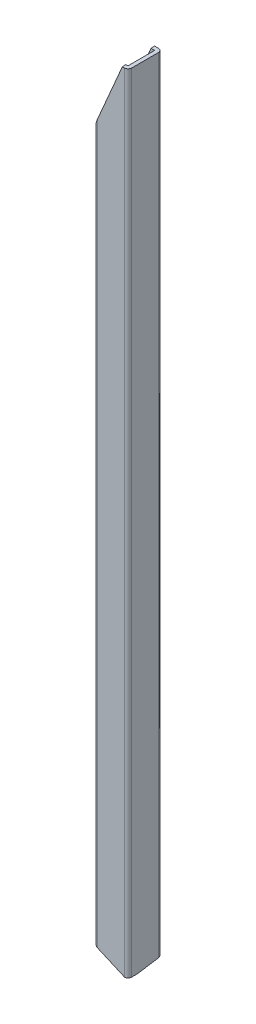
ISO-10303-21;
HEADER;
FILE_DESCRIPTION(('STEP AP214'),'2;1');
FILE_NAME('part.step','',(''),(''),'','','');
FILE_SCHEMA(('AUTOMOTIVE_DESIGN { 1 0 10303 214 1 1 1 1 }'));
ENDSEC;
DATA;
#1=APPLICATION_CONTEXT('core data for automotive mechanical design processes');
#2=APPLICATION_PROTOCOL_DEFINITION('international standard','automotive_design',2000,#1);
#3=PRODUCT_CONTEXT('',#1,'mechanical');
#4=PRODUCT('Part','Part','',(#3));
#5=PRODUCT_RELATED_PRODUCT_CATEGORY('part','',(#4));
#6=PRODUCT_DEFINITION_FORMATION('','',#4);
#7=PRODUCT_DEFINITION_CONTEXT('part definition',#1,'design');
#8=PRODUCT_DEFINITION('design','',#6,#7);
#9=PRODUCT_DEFINITION_SHAPE('','',#8);
#10=(LENGTH_UNIT() NAMED_UNIT(*) SI_UNIT(.MILLI.,.METRE.));
#11=(NAMED_UNIT(*) PLANE_ANGLE_UNIT() SI_UNIT($,.RADIAN.));
#12=(NAMED_UNIT(*) SI_UNIT($,.STERADIAN.) SOLID_ANGLE_UNIT());
#13=UNCERTAINTY_MEASURE_WITH_UNIT(LENGTH_MEASURE(1.E-05),#10,'distance_accuracy_value','');
#14=(GEOMETRIC_REPRESENTATION_CONTEXT(3) GLOBAL_UNCERTAINTY_ASSIGNED_CONTEXT((#13)) GLOBAL_UNIT_ASSIGNED_CONTEXT((#10,
#11,#12)) REPRESENTATION_CONTEXT('',''));
#15=CARTESIAN_POINT('',(0.,0.,0.));
#16=DIRECTION('',(0.,0.,1.));
#17=DIRECTION('',(1.,0.,0.));
#18=AXIS2_PLACEMENT_3D('',#15,#16,#17);
#19=CARTESIAN_POINT('',(2.80000000000002,590.8,0.));
#20=DIRECTION('',(0.,0.,1.));
#21=DIRECTION('',(1.,0.,0.));
#22=AXIS2_PLACEMENT_3D('',#19,#20,#21);
#23=PLANE('',#22);
#24=DIRECTION('',(0.39540036227563,0.918508875031864,0.));
#25=VECTOR('',#24,1.);
#26=CARTESIAN_POINT('',(17.2174877375602,584.593549491465,0.));
#27=LINE('',#26,#25);
#28=CARTESIAN_POINT('',(2.79999999999993,551.101950327524,0.));
#29=VERTEX_POINT('',#28);
#30=CARTESIAN_POINT('',(19.8892450239942,590.8,0.));
#31=VERTEX_POINT('',#30);
#32=EDGE_CURVE('E166',#29,#31,#27,.T.);
#33=ORIENTED_EDGE('',*,*,#32,.T.);
#34=DIRECTION('',(-1.,0.,0.));
#35=VECTOR('',#34,1.);
#36=CARTESIAN_POINT('',(2.80000000000002,590.8,0.));
#37=LINE('',#36,#35);
#38=CARTESIAN_POINT('',(22.8,590.8,0.));
#39=VERTEX_POINT('',#38);
#40=EDGE_CURVE('E191',#39,#31,#37,.T.);
#41=ORIENTED_EDGE('',*,*,#40,.F.);
#42=DIRECTION('',(0.,-1.,0.));
#43=VECTOR('',#42,1.);
#44=CARTESIAN_POINT('',(22.8,590.8,0.));
#45=LINE('',#44,#43);
#46=CARTESIAN_POINT('',(22.8,4.11609931174119,0.));
#47=VERTEX_POINT('',#46);
#48=EDGE_CURVE('E124',#39,#47,#45,.T.);
#49=ORIENTED_EDGE('',*,*,#48,.T.);
#50=DIRECTION('',(0.915754313649765,-0.401738767150804,0.));
#51=VECTOR('',#50,1.);
#52=CARTESIAN_POINT('',(-209.809611486821,106.161262684985,0.));
#53=LINE('',#52,#51);
#54=CARTESIAN_POINT('',(2.80000000000002,12.8900414305539,0.));
#55=VERTEX_POINT('',#54);
#56=EDGE_CURVE('E110',#55,#47,#53,.T.);
#57=ORIENTED_EDGE('',*,*,#56,.F.);
#58=DIRECTION('',(0.,-1.,0.));
#59=VECTOR('',#58,1.);
#60=CARTESIAN_POINT('',(2.80000000000002,590.8,0.));
#61=LINE('',#60,#59);
#62=EDGE_CURVE('E120',#29,#55,#61,.T.);
#63=ORIENTED_EDGE('',*,*,#62,.F.);
#64=EDGE_LOOP('',(#33,#41,#49,#57,#63));
#65=FACE_BOUND('',#64,.T.);
#66=ADVANCED_FACE('F38',(#65),#23,.F.);
#67=CARTESIAN_POINT('',(2.8,590.8,2.8));
#68=DIRECTION('',(0.,-1.,0.));
#69=DIRECTION('',(0.,0.,-1.));
#70=AXIS2_PLACEMENT_3D('',#67,#68,#69);
#71=CYLINDRICAL_SURFACE('',#70,2.8);
#72=CARTESIAN_POINT('',(2.8,550.732963372258,2.8));
#73=DIRECTION('',(-0.917264503130894,0.394864684163176,0.0520356848398305));
#74=DIRECTION('',(-0.394230836374375,-0.918739289026389,0.0223644014193281));
#75=AXIS2_PLACEMENT_3D('',#72,#73,#74);
#76=ELLIPSE('',#75,7.09103678373758,2.8);
#77=CARTESIAN_POINT('',(0.,544.22860704014,2.80000000000002));
#78=VERTEX_POINT('',#77);
#79=EDGE_CURVE('E240',#29,#78,#76,.T.);
#80=ORIENTED_EDGE('',*,*,#79,.F.);
#81=ORIENTED_EDGE('',*,*,#62,.T.);
#82=CARTESIAN_POINT('',(2.8,12.4565004084244,2.8));
#83=DIRECTION('',(-0.397760197031321,-0.906685254233582,-0.140387589953636));
#84=DIRECTION('',(0.854994325271738,-0.421807835104311,0.301766224083711));
#85=AXIS2_PLACEMENT_3D('',#82,#83,#84);
#86=ELLIPSE('',#85,3.08817198352567,2.8);
#87=CARTESIAN_POINT('',(0.,13.684852305058,2.80000000000002));
#88=VERTEX_POINT('',#87);
#89=EDGE_CURVE('E156',#88,#55,#86,.T.);
#90=ORIENTED_EDGE('',*,*,#89,.F.);
#91=DIRECTION('',(0.,-1.,0.));
#92=VECTOR('',#91,1.);
#93=CARTESIAN_POINT('',(0.,590.8,2.80000000000002));
#94=LINE('',#93,#92);
#95=EDGE_CURVE('E123',#78,#88,#94,.T.);
#96=ORIENTED_EDGE('',*,*,#95,.F.);
#97=EDGE_LOOP('',(#80,#81,#90,#96));
#98=FACE_BOUND('',#97,.T.);
#99=ADVANCED_FACE('F234',(#98),#71,.T.);
#100=CARTESIAN_POINT('',(0.,590.8,2.80000000000002));
#101=DIRECTION('',(1.,0.,0.));
#102=DIRECTION('',(0.,0.,-1.));
#103=AXIS2_PLACEMENT_3D('',#100,#101,#102);
#104=PLANE('',#103);
#105=DIRECTION('',(0.,-0.130651475613471,0.991428359449145));
#106=VECTOR('',#105,1.);
#107=CARTESIAN_POINT('',(0.,545.023571779982,-3.23246602566669));
#108=LINE('',#107,#106);
#109=CARTESIAN_POINT('',(0.,541.592985931096,22.8));
#110=VERTEX_POINT('',#109);
#111=EDGE_CURVE('E206',#78,#110,#108,.T.);
#112=ORIENTED_EDGE('',*,*,#111,.F.);
#113=ORIENTED_EDGE('',*,*,#95,.T.);
#114=DIRECTION('',(0.,0.153012762588992,-0.988224212658688));
#115=VECTOR('',#114,1.);
#116=CARTESIAN_POINT('',(0.,27.1967947293815,-84.4661106030328));
#117=LINE('',#116,#115);
#118=CARTESIAN_POINT('',(0.,10.5881307184189,22.8));
#119=VERTEX_POINT('',#118);
#120=EDGE_CURVE('E162',#119,#88,#117,.T.);
#121=ORIENTED_EDGE('',*,*,#120,.F.);
#122=DIRECTION('',(0.,-1.,0.));
#123=VECTOR('',#122,1.);
#124=CARTESIAN_POINT('',(0.,590.8,22.8));
#125=LINE('',#124,#123);
#126=EDGE_CURVE('E127',#110,#119,#125,.T.);
#127=ORIENTED_EDGE('',*,*,#126,.F.);
#128=EDGE_LOOP('',(#112,#113,#121,#127));
#129=FACE_BOUND('',#128,.T.);
#130=ADVANCED_FACE('F305',(#129),#104,.F.);
#131=CARTESIAN_POINT('',(2.8,590.8,22.8));
#132=DIRECTION('',(0.,-1.,0.));
#133=DIRECTION('',(0.,0.,-1.));
#134=AXIS2_PLACEMENT_3D('',#131,#132,#133);
#135=CYLINDRICAL_SURFACE('',#134,2.8);
#136=CARTESIAN_POINT('',(2.8,548.097342263214,22.8));
#137=DIRECTION('',(-0.917264503130894,0.394864684163176,0.0520356848398305));
#138=DIRECTION('',(-0.394230836374375,-0.918739289026389,0.0223644014193281));
#139=AXIS2_PLACEMENT_3D('',#136,#137,#138);
#140=ELLIPSE('',#139,7.09103678373758,2.8);
#141=CARTESIAN_POINT('',(2.80000000000002,547.728355307947,25.6));
#142=VERTEX_POINT('',#141);
#143=EDGE_CURVE('E200',#110,#142,#140,.T.);
#144=ORIENTED_EDGE('',*,*,#143,.F.);
#145=ORIENTED_EDGE('',*,*,#126,.T.);
#146=CARTESIAN_POINT('',(2.8,9.35977882178507,22.8));
#147=DIRECTION('',(-0.397760197031321,-0.906685254233582,-0.140387589953636));
#148=DIRECTION('',(0.854994325271738,-0.421807835104311,0.301766224083711));
#149=AXIS2_PLACEMENT_3D('',#146,#147,#148);
#150=ELLIPSE('',#149,3.08817198352567,2.8);
#151=CARTESIAN_POINT('',(2.80000000000002,8.92623779965548,25.6));
#152=VERTEX_POINT('',#151);
#153=EDGE_CURVE('E218',#152,#119,#150,.T.);
#154=ORIENTED_EDGE('',*,*,#153,.F.);
#155=DIRECTION('',(0.,-1.,0.));
#156=VECTOR('',#155,1.);
#157=CARTESIAN_POINT('',(2.80000000000002,590.8,25.6));
#158=LINE('',#157,#156);
#159=EDGE_CURVE('E130',#142,#152,#158,.T.);
#160=ORIENTED_EDGE('',*,*,#159,.F.);
#161=EDGE_LOOP('',(#144,#145,#154,#160));
#162=FACE_BOUND('',#161,.T.);
#163=ADVANCED_FACE('F304',(#162),#135,.T.);
#164=CARTESIAN_POINT('',(2.80000000000002,590.8,25.6));
#165=DIRECTION('',(0.,0.,-1.));
#166=DIRECTION('',(-1.,0.,0.));
#167=AXIS2_PLACEMENT_3D('',#164,#165,#166);
#168=PLANE('',#167);
#169=DIRECTION('',(-0.39540036227563,-0.918508875031864,0.));
#170=VECTOR('',#169,1.);
#171=CARTESIAN_POINT('',(18.4427057325885,584.06611676624,25.6));
#172=LINE('',#171,#170);
#173=CARTESIAN_POINT('',(21.341512638573,590.8,25.6));
#174=VERTEX_POINT('',#173);
#175=EDGE_CURVE('E155',#174,#142,#172,.T.);
#176=ORIENTED_EDGE('',*,*,#175,.T.);
#177=ORIENTED_EDGE('',*,*,#159,.T.);
#178=DIRECTION('',(-0.915754313649765,0.401738767150804,0.));
#179=VECTOR('',#178,1.);
#180=CARTESIAN_POINT('',(-211.267871095396,102.837193324079,25.6));
#181=LINE('',#180,#179);
#182=CARTESIAN_POINT('',(22.8,0.152295680842851,25.6));
#183=VERTEX_POINT('',#182);
#184=EDGE_CURVE('E114',#183,#152,#181,.T.);
#185=ORIENTED_EDGE('',*,*,#184,.F.);
#186=DIRECTION('',(0.,-1.,0.));
#187=VECTOR('',#186,1.);
#188=CARTESIAN_POINT('',(22.8,590.8,25.6));
#189=LINE('',#188,#187);
#190=CARTESIAN_POINT('',(22.8,590.8,25.6));
#191=VERTEX_POINT('',#190);
#192=EDGE_CURVE('E175',#191,#183,#189,.T.);
#193=ORIENTED_EDGE('',*,*,#192,.F.);
#194=DIRECTION('',(1.,0.,0.));
#195=VECTOR('',#194,1.);
#196=CARTESIAN_POINT('',(2.80000000000002,590.8,25.6));
#197=LINE('',#196,#195);
#198=EDGE_CURVE('E189',#174,#191,#197,.T.);
#199=ORIENTED_EDGE('',*,*,#198,.F.);
#200=EDGE_LOOP('',(#176,#177,#185,#193,#199));
#201=FACE_BOUND('',#200,.T.);
#202=ADVANCED_FACE('F300',(#201),#168,.F.);
#203=CARTESIAN_POINT('',(2.8,590.8,2.8));
#204=DIRECTION('',(0.,0.,-1.));
#205=DIRECTION('',(-1.,0.,0.));
#206=AXIS2_PLACEMENT_3D('',#203,#204,#205);
#207=PLANE('',#206);
#208=DIRECTION('',(-0.39540036227563,-0.918508875031864,0.));
#209=VECTOR('',#208,1.);
#210=CARTESIAN_POINT('',(17.3514959557665,584.535861537143,2.8));
#211=LINE('',#210,#209);
#212=CARTESIAN_POINT('',(20.0480867943388,590.8,2.8));
#213=VERTEX_POINT('',#212);
#214=CARTESIAN_POINT('',(2.8,550.732963372258,2.79999999999999));
#215=VERTEX_POINT('',#214);
#216=EDGE_CURVE('E159',#213,#215,#211,.T.);
#217=ORIENTED_EDGE('',*,*,#216,.T.);
#218=DIRECTION('',(0.,-1.,0.));
#219=VECTOR('',#218,1.);
#220=CARTESIAN_POINT('',(2.8,590.8,2.8));
#221=LINE('',#220,#219);
#222=CARTESIAN_POINT('',(2.8,12.4565004084244,2.8));
#223=VERTEX_POINT('',#222);
#224=EDGE_CURVE('E134',#215,#223,#221,.T.);
#225=ORIENTED_EDGE('',*,*,#224,.T.);
#226=DIRECTION('',(-0.915754313649765,0.401738767150804,0.));
#227=VECTOR('',#226,1.);
#228=CARTESIAN_POINT('',(-209.969108631509,105.797692598636,2.79999999999996));
#229=LINE('',#228,#227);
#230=CARTESIAN_POINT('',(22.8,3.68255828961173,2.8));
#231=VERTEX_POINT('',#230);
#232=EDGE_CURVE('E113',#231,#223,#229,.T.);
#233=ORIENTED_EDGE('',*,*,#232,.F.);
#234=DIRECTION('',(0.,-1.,0.));
#235=VECTOR('',#234,1.);
#236=CARTESIAN_POINT('',(22.8,590.8,2.8));
#237=LINE('',#236,#235);
#238=CARTESIAN_POINT('',(22.8,590.8,2.8));
#239=VERTEX_POINT('',#238);
#240=EDGE_CURVE('E133',#239,#231,#237,.T.);
#241=ORIENTED_EDGE('',*,*,#240,.F.);
#242=DIRECTION('',(1.,0.,0.));
#243=VECTOR('',#242,1.);
#244=CARTESIAN_POINT('',(2.8,590.8,2.8));
#245=LINE('',#244,#243);
#246=EDGE_CURVE('E71',#213,#239,#245,.T.);
#247=ORIENTED_EDGE('',*,*,#246,.F.);
#248=EDGE_LOOP('',(#217,#225,#233,#241,#247));
#249=FACE_BOUND('',#248,.T.);
#250=ADVANCED_FACE('F198',(#249),#207,.F.);
#251=CARTESIAN_POINT('',(2.8,590.8,2.8));
#252=DIRECTION('',(-1.,0.,0.));
#253=DIRECTION('',(0.,0.,1.));
#254=AXIS2_PLACEMENT_3D('',#251,#252,#253);
#255=PLANE('',#254);
#256=DIRECTION('',(0.,0.130651475613471,-0.991428359449145));
#257=VECTOR('',#256,1.);
#258=CARTESIAN_POINT('',(2.8,551.416899997827,-2.38994648526668));
#259=LINE('',#258,#257);
#260=CARTESIAN_POINT('',(2.8,548.097342263214,22.8));
#261=VERTEX_POINT('',#260);
#262=EDGE_CURVE('E148',#261,#215,#259,.T.);
#263=ORIENTED_EDGE('',*,*,#262,.F.);
#264=DIRECTION('',(0.,-1.,0.));
#265=VECTOR('',#264,1.);
#266=CARTESIAN_POINT('',(2.8,590.8,22.8));
#267=LINE('',#266,#265);
#268=CARTESIAN_POINT('',(2.79999999999999,9.35977882178506,22.8));
#269=VERTEX_POINT('',#268);
#270=EDGE_CURVE('E90',#261,#269,#267,.T.);
#271=ORIENTED_EDGE('',*,*,#270,.T.);
#272=DIRECTION('',(0.,-0.153012762588992,0.988224212658689));
#273=VECTOR('',#272,1.);
#274=CARTESIAN_POINT('',(2.80000000000003,25.9972021196431,-84.6518508195203));
#275=LINE('',#274,#273);
#276=EDGE_CURVE('E145',#223,#269,#275,.T.);
#277=ORIENTED_EDGE('',*,*,#276,.F.);
#278=ORIENTED_EDGE('',*,*,#224,.F.);
#279=EDGE_LOOP('',(#263,#271,#277,#278));
#280=FACE_BOUND('',#279,.T.);
#281=ADVANCED_FACE('F141',(#280),#255,.F.);
#282=CARTESIAN_POINT('',(2.8,590.8,22.8));
#283=DIRECTION('',(0.,0.,1.));
#284=DIRECTION('',(1.,0.,0.));
#285=AXIS2_PLACEMENT_3D('',#282,#283,#284);
#286=PLANE('',#285);
#287=DIRECTION('',(0.39540036227563,0.918508875031864,0.));
#288=VECTOR('',#287,1.);
#289=CARTESIAN_POINT('',(18.3086975143823,584.123804720562,22.8));
#290=LINE('',#289,#288);
#291=CARTESIAN_POINT('',(21.1826708682284,590.8,22.8));
#292=VERTEX_POINT('',#291);
#293=EDGE_CURVE('E99',#261,#292,#290,.T.);
#294=ORIENTED_EDGE('',*,*,#293,.T.);
#295=DIRECTION('',(-1.,0.,0.));
#296=VECTOR('',#295,1.);
#297=CARTESIAN_POINT('',(2.8,590.8,22.8));
#298=LINE('',#297,#296);
#299=CARTESIAN_POINT('',(22.8,590.8,22.8));
#300=VERTEX_POINT('',#299);
#301=EDGE_CURVE('E94',#300,#292,#298,.T.);
#302=ORIENTED_EDGE('',*,*,#301,.F.);
#303=DIRECTION('',(0.,-1.,0.));
#304=VECTOR('',#303,1.);
#305=CARTESIAN_POINT('',(22.8,590.8,22.8));
#306=LINE('',#305,#304);
#307=CARTESIAN_POINT('',(22.8,0.585836702972464,22.8));
#308=VERTEX_POINT('',#307);
#309=EDGE_CURVE('E79',#300,#308,#306,.T.);
#310=ORIENTED_EDGE('',*,*,#309,.T.);
#311=DIRECTION('',(0.915754313649765,-0.401738767150804,0.));
#312=VECTOR('',#311,1.);
#313=CARTESIAN_POINT('',(-211.108373950708,103.200763410428,22.8));
#314=LINE('',#313,#312);
#315=EDGE_CURVE('E117',#269,#308,#314,.T.);
#316=ORIENTED_EDGE('',*,*,#315,.F.);
#317=ORIENTED_EDGE('',*,*,#270,.F.);
#318=EDGE_LOOP('',(#294,#302,#310,#316,#317));
#319=FACE_BOUND('',#318,.T.);
#320=ADVANCED_FACE('F95',(#319),#286,.F.);
#321=CARTESIAN_POINT('',(22.8,590.8,2.8));
#322=DIRECTION('',(0.,-1.,0.));
#323=DIRECTION('',(0.,0.,-1.));
#324=AXIS2_PLACEMENT_3D('',#321,#322,#323);
#325=PLANE('',#324);
#326=ORIENTED_EDGE('',*,*,#40,.T.);
#327=DIRECTION('',(0.0566381403966886,0.,0.998394772147974));
#328=VECTOR('',#327,1.);
#329=CARTESIAN_POINT('',(20.0569145987768,590.8,2.95561305047735));
#330=LINE('',#329,#328);
#331=EDGE_CURVE('E12',#31,#213,#330,.T.);
#332=ORIENTED_EDGE('',*,*,#331,.T.);
#333=ORIENTED_EDGE('',*,*,#246,.T.);
#334=DIRECTION('',(0.,0.,1.));
#335=VECTOR('',#334,1.);
#336=CARTESIAN_POINT('',(22.8,590.8,2.8));
#337=LINE('',#336,#335);
#338=EDGE_CURVE('E83',#239,#300,#337,.T.);
#339=ORIENTED_EDGE('',*,*,#338,.T.);
#340=ORIENTED_EDGE('',*,*,#301,.T.);
#341=EDGE_CURVE('E41',#292,#174,#330,.T.);
#342=ORIENTED_EDGE('',*,*,#341,.T.);
#343=ORIENTED_EDGE('',*,*,#198,.T.);
#344=CARTESIAN_POINT('',(22.8,590.8,22.8));
#345=DIRECTION('',(0.,1.,0.));
#346=DIRECTION('',(0.,0.,1.));
#347=AXIS2_PLACEMENT_3D('',#344,#345,#346);
#348=CIRCLE('',#347,2.8);
#349=CARTESIAN_POINT('',(25.6,590.8,22.8));
#350=VERTEX_POINT('',#349);
#351=EDGE_CURVE('E187',#191,#350,#348,.T.);
#352=ORIENTED_EDGE('',*,*,#351,.T.);
#353=DIRECTION('',(0.,0.,-1.));
#354=VECTOR('',#353,1.);
#355=CARTESIAN_POINT('',(25.6,590.8,2.80000000000002));
#356=LINE('',#355,#354);
#357=CARTESIAN_POINT('',(25.6,590.8,2.80000000000002));
#358=VERTEX_POINT('',#357);
#359=EDGE_CURVE('E54',#350,#358,#356,.T.);
#360=ORIENTED_EDGE('',*,*,#359,.T.);
#361=CARTESIAN_POINT('',(22.8,590.8,2.8));
#362=DIRECTION('',(0.,1.,0.));
#363=DIRECTION('',(0.,0.,-1.));
#364=AXIS2_PLACEMENT_3D('',#361,#362,#363);
#365=CIRCLE('',#364,2.8);
#366=EDGE_CURVE('E102',#358,#39,#365,.T.);
#367=ORIENTED_EDGE('',*,*,#366,.T.);
#368=EDGE_LOOP('',(#326,#332,#333,#339,#340,#342,#343,#352,#360,#367));
#369=FACE_BOUND('',#368,.T.);
#370=ADVANCED_FACE('F105',(#369),#325,.F.);
#371=CARTESIAN_POINT('',(22.8,590.8,2.8));
#372=DIRECTION('',(0.,-1.,0.));
#373=DIRECTION('',(0.,0.,-1.));
#374=AXIS2_PLACEMENT_3D('',#371,#372,#373);
#375=CYLINDRICAL_SURFACE('',#374,2.8);
#376=CARTESIAN_POINT('',(22.8,3.68255828961173,2.8));
#377=DIRECTION('',(-0.397760197031321,-0.906685254233582,-0.140387589953636));
#378=DIRECTION('',(0.854994325271738,-0.421807835104311,0.301766224083711));
#379=AXIS2_PLACEMENT_3D('',#376,#377,#378);
#380=ELLIPSE('',#379,3.08817198352567,2.8);
#381=CARTESIAN_POINT('',(25.6,2.45420639297789,2.80000000000002));
#382=VERTEX_POINT('',#381);
#383=EDGE_CURVE('E199',#47,#382,#380,.T.);
#384=ORIENTED_EDGE('',*,*,#383,.F.);
#385=ORIENTED_EDGE('',*,*,#48,.F.);
#386=ORIENTED_EDGE('',*,*,#366,.F.);
#387=DIRECTION('',(0.,-1.,0.));
#388=VECTOR('',#387,1.);
#389=CARTESIAN_POINT('',(25.6,590.8,2.80000000000002));
#390=LINE('',#389,#388);
#391=EDGE_CURVE('E171',#358,#382,#390,.T.);
#392=ORIENTED_EDGE('',*,*,#391,.T.);
#393=EDGE_LOOP('',(#384,#385,#386,#392));
#394=FACE_BOUND('',#393,.T.);
#395=ADVANCED_FACE('F249',(#394),#375,.T.);
#396=CARTESIAN_POINT('',(22.8,0.,2.8));
#397=DIRECTION('',(0.,-1.,0.));
#398=DIRECTION('',(0.,0.,-1.));
#399=AXIS2_PLACEMENT_3D('',#396,#397,#398);
#400=PLANE('',#399);
#401=CARTESIAN_POINT('',(22.8,0.,22.8));
#402=DIRECTION('',(0.,1.,0.));
#403=DIRECTION('',(0.,0.,1.));
#404=AXIS2_PLACEMENT_3D('',#401,#402,#403);
#405=CIRCLE('',#404,2.8);
#406=CARTESIAN_POINT('',(23.1551356591276,0.,25.5773870208554));
#407=VERTEX_POINT('',#406);
#408=CARTESIAN_POINT('',(25.6,0.,22.8));
#409=VERTEX_POINT('',#408);
#410=EDGE_CURVE('E89',#407,#409,#405,.T.);
#411=ORIENTED_EDGE('',*,*,#410,.F.);
#412=DIRECTION('',(0.332823570996303,0.,-0.942989114777721));
#413=VECTOR('',#412,1.);
#414=CARTESIAN_POINT('',(30.2644569826964,0.,5.43454496939225));
#415=LINE('',#414,#413);
#416=CARTESIAN_POINT('',(25.6,0.,18.6503522148478));
#417=VERTEX_POINT('',#416);
#418=EDGE_CURVE('E212',#407,#417,#415,.T.);
#419=ORIENTED_EDGE('',*,*,#418,.T.);
#420=DIRECTION('',(0.,0.,-1.));
#421=VECTOR('',#420,1.);
#422=CARTESIAN_POINT('',(25.6,0.,2.80000000000002));
#423=LINE('',#422,#421);
#424=EDGE_CURVE('E178',#409,#417,#423,.T.);
#425=ORIENTED_EDGE('',*,*,#424,.F.);
#426=EDGE_LOOP('',(#411,#419,#425));
#427=FACE_BOUND('',#426,.T.);
#428=ADVANCED_FACE('F262',(#427),#400,.T.);
#429=CARTESIAN_POINT('',(22.8,590.8,2.8));
#430=DIRECTION('',(1.,0.,0.));
#431=DIRECTION('',(0.,0.,-1.));
#432=AXIS2_PLACEMENT_3D('',#429,#430,#431);
#433=PLANE('',#432);
#434=DIRECTION('',(0.,0.153012762588992,-0.988224212658689));
#435=VECTOR('',#434,1.);
#436=CARTESIAN_POINT('',(22.8,17.4286834786532,-85.978566651574));
#437=LINE('',#436,#435);
#438=EDGE_CURVE('E86',#308,#231,#437,.T.);
#439=ORIENTED_EDGE('',*,*,#438,.F.);
#440=ORIENTED_EDGE('',*,*,#309,.F.);
#441=ORIENTED_EDGE('',*,*,#338,.F.);
#442=ORIENTED_EDGE('',*,*,#240,.T.);
#443=EDGE_LOOP('',(#439,#440,#441,#442));
#444=FACE_BOUND('',#443,.T.);
#445=ADVANCED_FACE('F81',(#444),#433,.F.);
#446=CARTESIAN_POINT('',(22.8,590.8,22.8));
#447=DIRECTION('',(0.,-1.,0.));
#448=DIRECTION('',(0.,0.,-1.));
#449=AXIS2_PLACEMENT_3D('',#446,#447,#448);
#450=CYLINDRICAL_SURFACE('',#449,2.8);
#451=CARTESIAN_POINT('',(22.8,0.585836702972409,22.8));
#452=DIRECTION('',(-0.397760197031321,-0.906685254233582,-0.140387589953636));
#453=DIRECTION('',(0.854994325271738,-0.421807835104311,0.301766224083711));
#454=AXIS2_PLACEMENT_3D('',#451,#452,#453);
#455=ELLIPSE('',#454,3.08817198352567,2.8);
#456=EDGE_CURVE('E215',#407,#183,#455,.T.);
#457=ORIENTED_EDGE('',*,*,#456,.F.);
#458=ORIENTED_EDGE('',*,*,#410,.T.);
#459=DIRECTION('',(0.,-1.,0.));
#460=VECTOR('',#459,1.);
#461=CARTESIAN_POINT('',(25.6,590.8,22.8));
#462=LINE('',#461,#460);
#463=EDGE_CURVE('E107',#350,#409,#462,.T.);
#464=ORIENTED_EDGE('',*,*,#463,.F.);
#465=ORIENTED_EDGE('',*,*,#351,.F.);
#466=ORIENTED_EDGE('',*,*,#192,.T.);
#467=EDGE_LOOP('',(#457,#458,#464,#465,#466));
#468=FACE_BOUND('',#467,.T.);
#469=ADVANCED_FACE('F267',(#468),#450,.T.);
#470=CARTESIAN_POINT('',(25.6,590.8,2.80000000000002));
#471=DIRECTION('',(-1.,0.,0.));
#472=DIRECTION('',(0.,0.,1.));
#473=AXIS2_PLACEMENT_3D('',#470,#471,#472);
#474=PLANE('',#473);
#475=DIRECTION('',(0.,-0.153012762588992,0.988224212658688));
#476=VECTOR('',#475,1.);
#477=CARTESIAN_POINT('',(25.6,16.2290908689146,-86.1643068680617));
#478=LINE('',#477,#476);
#479=EDGE_CURVE('E203',#382,#417,#478,.T.);
#480=ORIENTED_EDGE('',*,*,#479,.F.);
#481=ORIENTED_EDGE('',*,*,#391,.F.);
#482=ORIENTED_EDGE('',*,*,#359,.F.);
#483=ORIENTED_EDGE('',*,*,#463,.T.);
#484=ORIENTED_EDGE('',*,*,#424,.T.);
#485=EDGE_LOOP('',(#480,#481,#482,#483,#484));
#486=FACE_BOUND('',#485,.T.);
#487=ADVANCED_FACE('F254',(#486),#474,.F.);
#488=CARTESIAN_POINT('',(3.3092874480575,7.26016435084996,34.9172762154343));
#489=DIRECTION('',(-0.397760197031321,-0.906685254233582,-0.140387589953636));
#490=DIRECTION('',(0.917452990822822,-0.394424072218434,-0.0520544031267875));
#491=AXIS2_PLACEMENT_3D('',#488,#489,#490);
#492=PLANE('',#491);
#493=ORIENTED_EDGE('',*,*,#56,.T.);
#494=ORIENTED_EDGE('',*,*,#383,.T.);
#495=ORIENTED_EDGE('',*,*,#479,.T.);
#496=ORIENTED_EDGE('',*,*,#418,.F.);
#497=ORIENTED_EDGE('',*,*,#456,.T.);
#498=ORIENTED_EDGE('',*,*,#184,.T.);
#499=ORIENTED_EDGE('',*,*,#153,.T.);
#500=ORIENTED_EDGE('',*,*,#120,.T.);
#501=ORIENTED_EDGE('',*,*,#89,.T.);
#502=EDGE_LOOP('',(#493,#494,#495,#496,#497,#498,#499,#500,#501));
#503=FACE_BOUND('',#502,.T.);
#504=ORIENTED_EDGE('',*,*,#438,.T.);
#505=ORIENTED_EDGE('',*,*,#232,.T.);
#506=ORIENTED_EDGE('',*,*,#276,.T.);
#507=ORIENTED_EDGE('',*,*,#315,.T.);
#508=EDGE_LOOP('',(#504,#505,#506,#507));
#509=FACE_BOUND('',#508,.T.);
#510=ADVANCED_FACE('F153',(#503,#509),#492,.T.);
#511=CARTESIAN_POINT('',(21.1307858286285,593.054045054193,4.78092143174));
#512=DIRECTION('',(0.917264503130894,-0.394864684163176,-0.0520356848398305));
#513=DIRECTION('',(0.0082803594898956,0.149530041903372,-0.988722510219674));
#514=AXIS2_PLACEMENT_3D('',#511,#512,#513);
#515=PLANE('',#514);
#516=ORIENTED_EDGE('',*,*,#32,.F.);
#517=ORIENTED_EDGE('',*,*,#79,.T.);
#518=ORIENTED_EDGE('',*,*,#111,.T.);
#519=ORIENTED_EDGE('',*,*,#143,.T.);
#520=ORIENTED_EDGE('',*,*,#175,.F.);
#521=ORIENTED_EDGE('',*,*,#341,.F.);
#522=ORIENTED_EDGE('',*,*,#293,.F.);
#523=ORIENTED_EDGE('',*,*,#262,.T.);
#524=ORIENTED_EDGE('',*,*,#216,.F.);
#525=ORIENTED_EDGE('',*,*,#331,.F.);
#526=EDGE_LOOP('',(#516,#517,#518,#519,#520,#521,#522,#523,#524,#525));
#527=FACE_BOUND('',#526,.T.);
#528=ADVANCED_FACE('F285',(#527),#515,.F.);
#529=CLOSED_SHELL('',(#66,#99,#130,#163,#202,#250,#281,#320,#370,#395,#428,#445,#469,#487,#510,#528));
#530=MANIFOLD_SOLID_BREP('B2',#529);
#531=ADVANCED_BREP_SHAPE_REPRESENTATION('',(#18,#530),#14);
#532=SHAPE_DEFINITION_REPRESENTATION(#9,#531);
ENDSEC;
END-ISO-10303-21;
